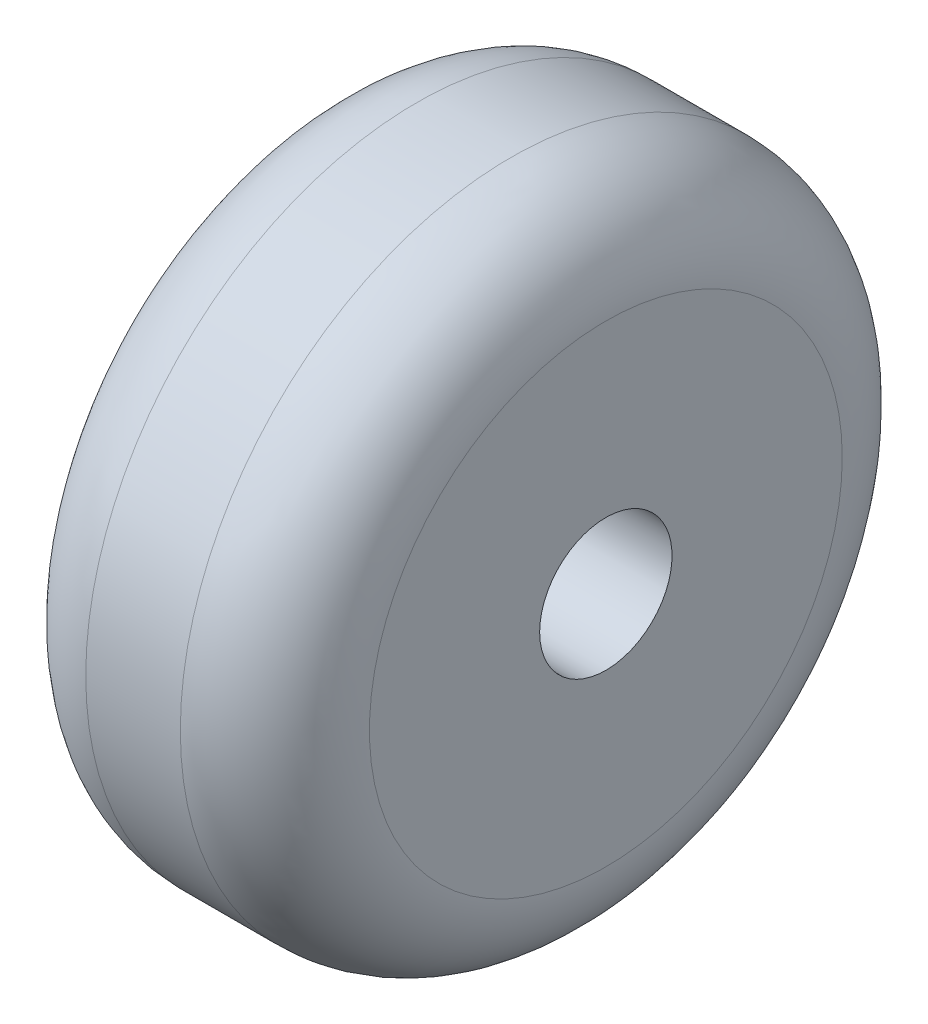
ISO-10303-21;
HEADER;
FILE_DESCRIPTION(('STEP AP214'),'2;1');
FILE_NAME('part.step','',(''),(''),'','','');
FILE_SCHEMA(('AUTOMOTIVE_DESIGN { 1 0 10303 214 1 1 1 1 }'));
ENDSEC;
DATA;
#1=APPLICATION_CONTEXT('core data for automotive mechanical design processes');
#2=APPLICATION_PROTOCOL_DEFINITION('international standard','automotive_design',2000,#1);
#3=PRODUCT_CONTEXT('',#1,'mechanical');
#4=PRODUCT('Part','Part','',(#3));
#5=PRODUCT_RELATED_PRODUCT_CATEGORY('part','',(#4));
#6=PRODUCT_DEFINITION_FORMATION('','',#4);
#7=PRODUCT_DEFINITION_CONTEXT('part definition',#1,'design');
#8=PRODUCT_DEFINITION('design','',#6,#7);
#9=PRODUCT_DEFINITION_SHAPE('','',#8);
#10=(LENGTH_UNIT() NAMED_UNIT(*) SI_UNIT(.MILLI.,.METRE.));
#11=(NAMED_UNIT(*) PLANE_ANGLE_UNIT() SI_UNIT($,.RADIAN.));
#12=(NAMED_UNIT(*) SI_UNIT($,.STERADIAN.) SOLID_ANGLE_UNIT());
#13=UNCERTAINTY_MEASURE_WITH_UNIT(LENGTH_MEASURE(1.E-05),#10,'distance_accuracy_value','');
#14=(GEOMETRIC_REPRESENTATION_CONTEXT(3) GLOBAL_UNCERTAINTY_ASSIGNED_CONTEXT((#13)) GLOBAL_UNIT_ASSIGNED_CONTEXT((#10,
#11,#12)) REPRESENTATION_CONTEXT('',''));
#15=CARTESIAN_POINT('',(0.,0.,0.));
#16=DIRECTION('',(0.,0.,1.));
#17=DIRECTION('',(1.,0.,0.));
#18=AXIS2_PLACEMENT_3D('',#15,#16,#17);
#19=CARTESIAN_POINT('',(25.4,0.,0.));
#20=DIRECTION('',(1.,0.,0.));
#21=DIRECTION('',(0.,0.,-1.));
#22=AXIS2_PLACEMENT_3D('',#19,#20,#21);
#23=TOROIDAL_SURFACE('',#22,63.5,25.4);
#24=CARTESIAN_POINT('',(0.,0.,0.));
#25=DIRECTION('',(1.,0.,0.));
#26=DIRECTION('',(0.,0.,-1.));
#27=AXIS2_PLACEMENT_3D('',#24,#25,#26);
#28=CIRCLE('',#27,63.5);
#29=CARTESIAN_POINT('',(0.,0.,-63.5));
#30=VERTEX_POINT('',#29);
#31=EDGE_CURVE('E49',#30,#30,#28,.F.);
#32=ORIENTED_EDGE('',*,*,#31,.F.);
#33=EDGE_LOOP('',(#32));
#34=FACE_BOUND('',#33,.T.);
#35=CARTESIAN_POINT('',(25.4,0.,0.));
#36=DIRECTION('',(1.,0.,0.));
#37=DIRECTION('',(0.,0.,-1.));
#38=AXIS2_PLACEMENT_3D('',#35,#36,#37);
#39=CIRCLE('',#38,88.9);
#40=CARTESIAN_POINT('',(25.4,0.,88.9));
#41=VERTEX_POINT('',#40);
#42=EDGE_CURVE('E10',#41,#41,#39,.T.);
#43=ORIENTED_EDGE('',*,*,#42,.F.);
#44=EDGE_LOOP('',(#43));
#45=FACE_BOUND('',#44,.T.);
#46=ADVANCED_FACE('F41',(#34,#45),#23,.T.);
#47=CARTESIAN_POINT('',(50.8,0.,0.));
#48=DIRECTION('',(1.,0.,0.));
#49=DIRECTION('',(0.,0.,-1.));
#50=AXIS2_PLACEMENT_3D('',#47,#48,#49);
#51=TOROIDAL_SURFACE('',#50,63.5,25.4);
#52=CARTESIAN_POINT('',(76.2,0.,0.));
#53=DIRECTION('',(1.,0.,0.));
#54=DIRECTION('',(0.,0.,-1.));
#55=AXIS2_PLACEMENT_3D('',#52,#53,#54);
#56=CIRCLE('',#55,63.5);
#57=CARTESIAN_POINT('',(76.2,0.,-63.5));
#58=VERTEX_POINT('',#57);
#59=EDGE_CURVE('E60',#58,#58,#56,.T.);
#60=ORIENTED_EDGE('',*,*,#59,.F.);
#61=EDGE_LOOP('',(#60));
#62=FACE_BOUND('',#61,.T.);
#63=CARTESIAN_POINT('',(50.8,0.,0.));
#64=DIRECTION('',(1.,0.,0.));
#65=DIRECTION('',(0.,0.,-1.));
#66=AXIS2_PLACEMENT_3D('',#63,#64,#65);
#67=CIRCLE('',#66,88.9);
#68=CARTESIAN_POINT('',(50.8,0.,88.9));
#69=VERTEX_POINT('',#68);
#70=EDGE_CURVE('E54',#69,#69,#67,.F.);
#71=ORIENTED_EDGE('',*,*,#70,.F.);
#72=EDGE_LOOP('',(#71));
#73=FACE_BOUND('',#72,.T.);
#74=ADVANCED_FACE('F87',(#62,#73),#51,.T.);
#75=CARTESIAN_POINT('',(76.2,0.,0.));
#76=DIRECTION('',(-1.,0.,0.));
#77=DIRECTION('',(0.,0.,1.));
#78=AXIS2_PLACEMENT_3D('',#75,#76,#77);
#79=CYLINDRICAL_SURFACE('',#78,88.9);
#80=CARTESIAN_POINT('',(25.4,0.,88.9));
#81=CARTESIAN_POINT('',(25.6645833333333,0.,88.9));
#82=CARTESIAN_POINT('',(25.9291666666667,0.,88.9));
#83=CARTESIAN_POINT('',(26.4583333333333,0.,88.9));
#84=CARTESIAN_POINT('',(26.7229166666667,0.,88.9));
#85=CARTESIAN_POINT('',(27.2520833333333,0.,88.9));
#86=CARTESIAN_POINT('',(27.5166666666667,0.,88.9));
#87=CARTESIAN_POINT('',(28.0458333333333,0.,88.9));
#88=CARTESIAN_POINT('',(28.3104166666667,0.,88.9));
#89=CARTESIAN_POINT('',(28.8395833333333,0.,88.9));
#90=CARTESIAN_POINT('',(29.1041666666667,0.,88.9));
#91=CARTESIAN_POINT('',(29.6333333333333,0.,88.9));
#92=CARTESIAN_POINT('',(29.8979166666667,0.,88.9));
#93=CARTESIAN_POINT('',(30.4270833333333,0.,88.9));
#94=CARTESIAN_POINT('',(30.6916666666667,0.,88.9));
#95=CARTESIAN_POINT('',(31.2208333333333,0.,88.9));
#96=CARTESIAN_POINT('',(31.4854166666667,0.,88.9));
#97=CARTESIAN_POINT('',(32.0145833333333,0.,88.9));
#98=CARTESIAN_POINT('',(32.2791666666667,0.,88.9));
#99=CARTESIAN_POINT('',(32.8083333333333,0.,88.9));
#100=CARTESIAN_POINT('',(33.0729166666667,0.,88.9));
#101=CARTESIAN_POINT('',(33.6020833333333,0.,88.9));
#102=CARTESIAN_POINT('',(33.8666666666667,0.,88.9));
#103=CARTESIAN_POINT('',(34.3958333333333,0.,88.9));
#104=CARTESIAN_POINT('',(34.6604166666667,0.,88.9));
#105=CARTESIAN_POINT('',(35.1895833333333,0.,88.9));
#106=CARTESIAN_POINT('',(35.4541666666667,0.,88.9));
#107=CARTESIAN_POINT('',(35.9833333333333,0.,88.9));
#108=CARTESIAN_POINT('',(36.2479166666667,0.,88.9));
#109=CARTESIAN_POINT('',(36.7770833333333,0.,88.9));
#110=CARTESIAN_POINT('',(37.0416666666667,0.,88.9));
#111=CARTESIAN_POINT('',(37.5708333333333,0.,88.9));
#112=CARTESIAN_POINT('',(37.8354166666667,0.,88.9));
#113=CARTESIAN_POINT('',(38.3645833333333,0.,88.9));
#114=CARTESIAN_POINT('',(38.6291666666667,0.,88.9));
#115=CARTESIAN_POINT('',(39.1583333333333,0.,88.9));
#116=CARTESIAN_POINT('',(39.4229166666667,0.,88.9));
#117=CARTESIAN_POINT('',(39.9520833333333,0.,88.9));
#118=CARTESIAN_POINT('',(40.2166666666667,0.,88.9));
#119=CARTESIAN_POINT('',(40.7458333333333,0.,88.9));
#120=CARTESIAN_POINT('',(41.0104166666667,0.,88.9));
#121=CARTESIAN_POINT('',(41.5395833333333,0.,88.9));
#122=CARTESIAN_POINT('',(41.8041666666667,0.,88.9));
#123=CARTESIAN_POINT('',(42.3333333333333,0.,88.9));
#124=CARTESIAN_POINT('',(42.5979166666667,0.,88.9));
#125=CARTESIAN_POINT('',(43.1270833333333,0.,88.9));
#126=CARTESIAN_POINT('',(43.3916666666667,0.,88.9));
#127=CARTESIAN_POINT('',(43.9208333333333,0.,88.9));
#128=CARTESIAN_POINT('',(44.1854166666667,0.,88.9));
#129=CARTESIAN_POINT('',(44.7145833333333,0.,88.9));
#130=CARTESIAN_POINT('',(44.9791666666667,0.,88.9));
#131=CARTESIAN_POINT('',(45.5083333333333,0.,88.9));
#132=CARTESIAN_POINT('',(45.7729166666667,0.,88.9));
#133=CARTESIAN_POINT('',(46.3020833333333,0.,88.9));
#134=CARTESIAN_POINT('',(46.5666666666667,0.,88.9));
#135=CARTESIAN_POINT('',(47.0958333333333,0.,88.9));
#136=CARTESIAN_POINT('',(47.3604166666667,0.,88.9));
#137=CARTESIAN_POINT('',(47.8895833333333,0.,88.9));
#138=CARTESIAN_POINT('',(48.1541666666667,0.,88.9));
#139=CARTESIAN_POINT('',(48.6833333333333,0.,88.9));
#140=CARTESIAN_POINT('',(48.9479166666667,0.,88.9));
#141=CARTESIAN_POINT('',(49.4770833333333,0.,88.9));
#142=CARTESIAN_POINT('',(49.7416666666667,0.,88.9));
#143=CARTESIAN_POINT('',(50.2708333333333,0.,88.9));
#144=CARTESIAN_POINT('',(50.5354166666667,0.,88.9));
#145=CARTESIAN_POINT('',(50.8,0.,88.9));
#146=B_SPLINE_CURVE_WITH_KNOTS('',3,(#80,#81,#82,#83,#84,#85,#86,#87,#88,#89,#90,#91,#92,#93,
#94,#95,#96,#97,#98,#99,#100,#101,#102,#103,#104,#105,#106,#107,#108,#109,#110,#111,#112,#113,
#114,#115,#116,#117,#118,#119,#120,#121,#122,#123,#124,#125,#126,#127,#128,#129,#130,#131,#132,
#133,#134,#135,#136,#137,#138,#139,#140,#141,#142,#143,#144,#145),.UNSPECIFIED.,.F.,.F.,(4,2,2,
2,2,2,2,2,2,2,2,2,2,2,2,2,2,2,2,2,2,2,2,2,2,2,2,2,2,2,2,2,4),(0.,0.793750000000003,1.5875,
2.38125,3.175,3.96875000000001,4.7625,5.55625000000001,6.35000000000001,7.14375,
7.93750000000001,8.73125000000001,9.52500000000001,10.31875,11.1125,11.90625,12.7,13.49375,
14.2875,15.08125,15.875,16.66875,17.4625,18.25625,19.05,19.84375,20.6375,21.43125,22.225,
23.01875,23.8125,24.60625,25.4),.UNSPECIFIED.);
#147=EDGE_CURVE('BSEAM92',#41,#69,#146,.T.);
#148=ORIENTED_EDGE('',*,*,#42,.T.);
#149=ORIENTED_EDGE('',*,*,#70,.T.);
#150=ORIENTED_EDGE('',*,*,#147,.T.);
#151=ORIENTED_EDGE('',*,*,#147,.F.);
#152=EDGE_LOOP('',(#148,#150,#149,#151));
#153=FACE_BOUND('',#152,.T.);
#154=ADVANCED_FACE('F92',(#153),#79,.T.);
#155=CARTESIAN_POINT('',(76.2,0.,0.));
#156=DIRECTION('',(1.,0.,0.));
#157=DIRECTION('',(0.,0.,-1.));
#158=AXIS2_PLACEMENT_3D('',#155,#156,#157);
#159=PLANE('',#158);
#160=CARTESIAN_POINT('',(76.2,0.,0.));
#161=DIRECTION('',(-1.,0.,0.));
#162=DIRECTION('',(0.,0.,1.));
#163=AXIS2_PLACEMENT_3D('',#160,#161,#162);
#164=CIRCLE('',#163,17.78);
#165=CARTESIAN_POINT('',(76.2,0.,17.78));
#166=VERTEX_POINT('',#165);
#167=EDGE_CURVE('E64',#166,#166,#164,.T.);
#168=ORIENTED_EDGE('',*,*,#167,.T.);
#169=EDGE_LOOP('',(#168));
#170=FACE_BOUND('',#169,.T.);
#171=ORIENTED_EDGE('',*,*,#59,.T.);
#172=EDGE_LOOP('',(#171));
#173=FACE_BOUND('',#172,.T.);
#174=ADVANCED_FACE('F83',(#170,#173),#159,.T.);
#175=CARTESIAN_POINT('',(0.,0.,0.));
#176=DIRECTION('',(1.,0.,0.));
#177=DIRECTION('',(0.,0.,-1.));
#178=AXIS2_PLACEMENT_3D('',#175,#176,#177);
#179=PLANE('',#178);
#180=CARTESIAN_POINT('',(0.,0.,0.));
#181=DIRECTION('',(1.,0.,0.));
#182=DIRECTION('',(0.,0.,-1.));
#183=AXIS2_PLACEMENT_3D('',#180,#181,#182);
#184=CIRCLE('',#183,17.78);
#185=CARTESIAN_POINT('',(0.,0.,17.78));
#186=VERTEX_POINT('',#185);
#187=EDGE_CURVE('E44',#186,#186,#184,.T.);
#188=ORIENTED_EDGE('',*,*,#187,.T.);
#189=EDGE_LOOP('',(#188));
#190=FACE_BOUND('',#189,.T.);
#191=ORIENTED_EDGE('',*,*,#31,.T.);
#192=EDGE_LOOP('',(#191));
#193=FACE_BOUND('',#192,.T.);
#194=ADVANCED_FACE('F73',(#190,#193),#179,.F.);
#195=CARTESIAN_POINT('',(76.2,0.,0.));
#196=DIRECTION('',(-1.,0.,0.));
#197=DIRECTION('',(0.,0.,1.));
#198=AXIS2_PLACEMENT_3D('',#195,#196,#197);
#199=CYLINDRICAL_SURFACE('',#198,17.78);
#200=CARTESIAN_POINT('',(76.2,0.,17.78));
#201=CARTESIAN_POINT('',(75.40625,0.,17.78));
#202=CARTESIAN_POINT('',(74.6125,0.,17.78));
#203=CARTESIAN_POINT('',(73.025,0.,17.78));
#204=CARTESIAN_POINT('',(72.23125,0.,17.78));
#205=CARTESIAN_POINT('',(70.64375,0.,17.78));
#206=CARTESIAN_POINT('',(69.85,0.,17.78));
#207=CARTESIAN_POINT('',(68.2625,0.,17.78));
#208=CARTESIAN_POINT('',(67.46875,0.,17.78));
#209=CARTESIAN_POINT('',(65.88125,0.,17.78));
#210=CARTESIAN_POINT('',(65.0875,0.,17.78));
#211=CARTESIAN_POINT('',(63.5,0.,17.78));
#212=CARTESIAN_POINT('',(62.70625,0.,17.78));
#213=CARTESIAN_POINT('',(61.11875,0.,17.78));
#214=CARTESIAN_POINT('',(60.325,0.,17.78));
#215=CARTESIAN_POINT('',(58.7375,0.,17.78));
#216=CARTESIAN_POINT('',(57.94375,0.,17.78));
#217=CARTESIAN_POINT('',(56.35625,0.,17.78));
#218=CARTESIAN_POINT('',(55.5625,0.,17.78));
#219=CARTESIAN_POINT('',(53.975,0.,17.78));
#220=CARTESIAN_POINT('',(53.18125,0.,17.78));
#221=CARTESIAN_POINT('',(51.59375,0.,17.78));
#222=CARTESIAN_POINT('',(50.8,0.,17.78));
#223=CARTESIAN_POINT('',(49.2125,0.,17.78));
#224=CARTESIAN_POINT('',(48.41875,0.,17.78));
#225=CARTESIAN_POINT('',(46.83125,0.,17.78));
#226=CARTESIAN_POINT('',(46.0375,0.,17.78));
#227=CARTESIAN_POINT('',(44.45,0.,17.78));
#228=CARTESIAN_POINT('',(43.65625,0.,17.78));
#229=CARTESIAN_POINT('',(42.06875,0.,17.78));
#230=CARTESIAN_POINT('',(41.275,0.,17.78));
#231=CARTESIAN_POINT('',(39.6875,0.,17.78));
#232=CARTESIAN_POINT('',(38.89375,0.,17.78));
#233=CARTESIAN_POINT('',(37.30625,0.,17.78));
#234=CARTESIAN_POINT('',(36.5125,0.,17.78));
#235=CARTESIAN_POINT('',(34.925,0.,17.78));
#236=CARTESIAN_POINT('',(34.13125,0.,17.78));
#237=CARTESIAN_POINT('',(32.54375,0.,17.78));
#238=CARTESIAN_POINT('',(31.75,0.,17.78));
#239=CARTESIAN_POINT('',(30.1625,0.,17.78));
#240=CARTESIAN_POINT('',(29.36875,0.,17.78));
#241=CARTESIAN_POINT('',(27.78125,0.,17.78));
#242=CARTESIAN_POINT('',(26.9875,0.,17.78));
#243=CARTESIAN_POINT('',(25.4,0.,17.78));
#244=CARTESIAN_POINT('',(24.60625,0.,17.78));
#245=CARTESIAN_POINT('',(23.01875,0.,17.78));
#246=CARTESIAN_POINT('',(22.225,0.,17.78));
#247=CARTESIAN_POINT('',(20.6375,0.,17.78));
#248=CARTESIAN_POINT('',(19.84375,0.,17.78));
#249=CARTESIAN_POINT('',(18.25625,0.,17.78));
#250=CARTESIAN_POINT('',(17.4625,0.,17.78));
#251=CARTESIAN_POINT('',(15.875,0.,17.78));
#252=CARTESIAN_POINT('',(15.08125,0.,17.78));
#253=CARTESIAN_POINT('',(13.49375,0.,17.78));
#254=CARTESIAN_POINT('',(12.7,0.,17.78));
#255=CARTESIAN_POINT('',(11.1125,0.,17.78));
#256=CARTESIAN_POINT('',(10.31875,0.,17.78));
#257=CARTESIAN_POINT('',(8.73125,0.,17.78));
#258=CARTESIAN_POINT('',(7.93750000000001,0.,17.78));
#259=CARTESIAN_POINT('',(6.35,0.,17.78));
#260=CARTESIAN_POINT('',(5.55625,0.,17.78));
#261=CARTESIAN_POINT('',(3.96875,0.,17.78));
#262=CARTESIAN_POINT('',(3.175,0.,17.78));
#263=CARTESIAN_POINT('',(1.5875,0.,17.78));
#264=CARTESIAN_POINT('',(0.793750000000001,0.,17.78));
#265=CARTESIAN_POINT('',(0.,0.,17.78));
#266=B_SPLINE_CURVE_WITH_KNOTS('',3,(#200,#201,#202,#203,#204,#205,#206,#207,#208,#209,#210,
#211,#212,#213,#214,#215,#216,#217,#218,#219,#220,#221,#222,#223,#224,#225,#226,#227,#228,#229,
#230,#231,#232,#233,#234,#235,#236,#237,#238,#239,#240,#241,#242,#243,#244,#245,#246,#247,#248,
#249,#250,#251,#252,#253,#254,#255,#256,#257,#258,#259,#260,#261,#262,#263,#264,#265),
.UNSPECIFIED.,.F.,.F.,(4,2,2,2,2,2,2,2,2,2,2,2,2,2,2,2,2,2,2,2,2,2,2,2,2,2,2,2,2,2,2,2,4),(0.,
2.38125,4.7625,7.14375,9.52500000000001,11.90625,14.2875,16.66875,19.05,21.43125,23.8125,
26.19375,28.575,30.95625,33.3375,35.71875,38.1,40.48125,42.8625,45.24375,47.625,50.00625,
52.3875,54.76875,57.15,59.53125,61.9125,64.29375,66.675,69.05625,71.4375,73.81875,76.2),.UNSPECIFIED.);
#267=EDGE_CURVE('BSEAM76',#166,#186,#266,.T.);
#268=ORIENTED_EDGE('',*,*,#167,.F.);
#269=ORIENTED_EDGE('',*,*,#187,.F.);
#270=ORIENTED_EDGE('',*,*,#267,.T.);
#271=ORIENTED_EDGE('',*,*,#267,.F.);
#272=EDGE_LOOP('',(#268,#270,#269,#271));
#273=FACE_BOUND('',#272,.T.);
#274=ADVANCED_FACE('F76',(#273),#199,.F.);
#275=CLOSED_SHELL('',(#46,#74,#154,#174,#194,#274));
#276=MANIFOLD_SOLID_BREP('B2',#275);
#277=ADVANCED_BREP_SHAPE_REPRESENTATION('',(#18,#276),#14);
#278=SHAPE_DEFINITION_REPRESENTATION(#9,#277);
ENDSEC;
END-ISO-10303-21;
